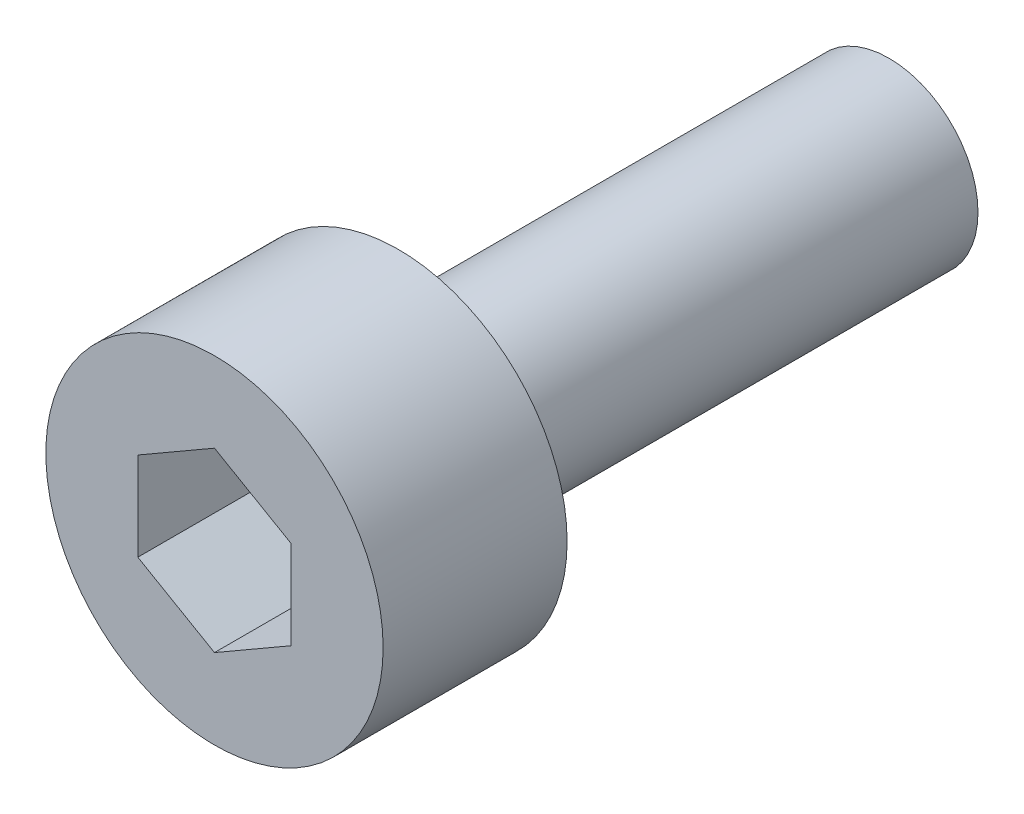
ISO-10303-21;
HEADER;
FILE_DESCRIPTION(('STEP AP214'),'2;1');
FILE_NAME('part.step','',(''),(''),'','','');
FILE_SCHEMA(('AUTOMOTIVE_DESIGN { 1 0 10303 214 1 1 1 1 }'));
ENDSEC;
DATA;
#1=APPLICATION_CONTEXT('core data for automotive mechanical design processes');
#2=APPLICATION_PROTOCOL_DEFINITION('international standard','automotive_design',2000,#1);
#3=PRODUCT_CONTEXT('',#1,'mechanical');
#4=PRODUCT('Part','Part','',(#3));
#5=PRODUCT_RELATED_PRODUCT_CATEGORY('part','',(#4));
#6=PRODUCT_DEFINITION_FORMATION('','',#4);
#7=PRODUCT_DEFINITION_CONTEXT('part definition',#1,'design');
#8=PRODUCT_DEFINITION('design','',#6,#7);
#9=PRODUCT_DEFINITION_SHAPE('','',#8);
#10=(LENGTH_UNIT() NAMED_UNIT(*) SI_UNIT(.MILLI.,.METRE.));
#11=(NAMED_UNIT(*) PLANE_ANGLE_UNIT() SI_UNIT($,.RADIAN.));
#12=(NAMED_UNIT(*) SI_UNIT($,.STERADIAN.) SOLID_ANGLE_UNIT());
#13=UNCERTAINTY_MEASURE_WITH_UNIT(LENGTH_MEASURE(1.E-05),#10,'distance_accuracy_value','');
#14=(GEOMETRIC_REPRESENTATION_CONTEXT(3) GLOBAL_UNCERTAINTY_ASSIGNED_CONTEXT((#13)) GLOBAL_UNIT_ASSIGNED_CONTEXT((#10,
#11,#12)) REPRESENTATION_CONTEXT('',''));
#15=CARTESIAN_POINT('',(0.,0.,0.));
#16=DIRECTION('',(0.,0.,1.));
#17=DIRECTION('',(1.,0.,0.));
#18=AXIS2_PLACEMENT_3D('',#15,#16,#17);
#19=CARTESIAN_POINT('',(0.,0.,-8.));
#20=DIRECTION('',(0.,0.,1.));
#21=DIRECTION('',(1.,0.,0.));
#22=AXIS2_PLACEMENT_3D('',#19,#20,#21);
#23=CYLINDRICAL_SURFACE('',#22,1.45);
#24=CARTESIAN_POINT('',(0.,0.,-8.));
#25=DIRECTION('',(0.,0.,1.));
#26=DIRECTION('',(1.,0.,0.));
#27=AXIS2_PLACEMENT_3D('',#24,#25,#26);
#28=CIRCLE('',#27,1.45);
#29=CARTESIAN_POINT('',(1.45,0.,-8.));
#30=VERTEX_POINT('',#29);
#31=EDGE_CURVE('E11',#30,#30,#28,.T.);
#32=ORIENTED_EDGE('',*,*,#31,.T.);
#33=EDGE_LOOP('',(#32));
#34=FACE_BOUND('',#33,.T.);
#35=CARTESIAN_POINT('',(0.,0.,0.));
#36=DIRECTION('',(0.,0.,1.));
#37=DIRECTION('',(1.,0.,0.));
#38=AXIS2_PLACEMENT_3D('',#35,#36,#37);
#39=CIRCLE('',#38,1.45);
#40=CARTESIAN_POINT('',(1.45,0.,0.));
#41=VERTEX_POINT('',#40);
#42=EDGE_CURVE('E44',#41,#41,#39,.T.);
#43=ORIENTED_EDGE('',*,*,#42,.F.);
#44=EDGE_LOOP('',(#43));
#45=FACE_BOUND('',#44,.T.);
#46=ADVANCED_FACE('F41',(#34,#45),#23,.T.);
#47=CARTESIAN_POINT('',(0.,0.,-8.));
#48=DIRECTION('',(0.,0.,1.));
#49=DIRECTION('',(1.,0.,0.));
#50=AXIS2_PLACEMENT_3D('',#47,#48,#49);
#51=PLANE('',#50);
#52=ORIENTED_EDGE('',*,*,#31,.F.);
#53=EDGE_LOOP('',(#52));
#54=FACE_BOUND('',#53,.T.);
#55=ADVANCED_FACE('F174',(#54),#51,.F.);
#56=CARTESIAN_POINT('',(0.,0.,3.));
#57=DIRECTION('',(0.,0.,-1.));
#58=DIRECTION('',(-1.,0.,0.));
#59=AXIS2_PLACEMENT_3D('',#56,#57,#58);
#60=CYLINDRICAL_SURFACE('',#59,2.75);
#61=CARTESIAN_POINT('',(0.,0.,3.));
#62=DIRECTION('',(0.,0.,1.));
#63=DIRECTION('',(1.,0.,0.));
#64=AXIS2_PLACEMENT_3D('',#61,#62,#63);
#65=CIRCLE('',#64,2.75);
#66=CARTESIAN_POINT('',(2.75,0.,3.));
#67=VERTEX_POINT('',#66);
#68=EDGE_CURVE('E148',#67,#67,#65,.T.);
#69=ORIENTED_EDGE('',*,*,#68,.F.);
#70=EDGE_LOOP('',(#69));
#71=FACE_BOUND('',#70,.T.);
#72=CARTESIAN_POINT('',(0.,0.,0.));
#73=DIRECTION('',(0.,0.,1.));
#74=DIRECTION('',(1.,0.,0.));
#75=AXIS2_PLACEMENT_3D('',#72,#73,#74);
#76=CIRCLE('',#75,2.75);
#77=CARTESIAN_POINT('',(2.75,0.,0.));
#78=VERTEX_POINT('',#77);
#79=EDGE_CURVE('E142',#78,#78,#76,.T.);
#80=ORIENTED_EDGE('',*,*,#79,.T.);
#81=EDGE_LOOP('',(#80));
#82=FACE_BOUND('',#81,.T.);
#83=ADVANCED_FACE('F154',(#71,#82),#60,.T.);
#84=CARTESIAN_POINT('',(0.,0.,3.));
#85=DIRECTION('',(0.,0.,1.));
#86=DIRECTION('',(1.,0.,0.));
#87=AXIS2_PLACEMENT_3D('',#84,#85,#86);
#88=PLANE('',#87);
#89=DIRECTION('',(0.,1.,0.));
#90=VECTOR('',#89,1.);
#91=CARTESIAN_POINT('',(1.25,-0.721687836487032,3.));
#92=LINE('',#91,#90);
#93=CARTESIAN_POINT('',(1.25,-0.721687836487032,3.));
#94=VERTEX_POINT('',#93);
#95=CARTESIAN_POINT('',(1.25,0.721687836487032,3.));
#96=VERTEX_POINT('',#95);
#97=EDGE_CURVE('E55',#94,#96,#92,.T.);
#98=ORIENTED_EDGE('',*,*,#97,.F.);
#99=DIRECTION('',(0.866025403784438,0.5,0.));
#100=VECTOR('',#99,1.);
#101=CARTESIAN_POINT('',(0.,-1.44337567297406,3.));
#102=LINE('',#101,#100);
#103=CARTESIAN_POINT('',(0.,-1.44337567297406,3.));
#104=VERTEX_POINT('',#103);
#105=EDGE_CURVE('E138',#104,#94,#102,.T.);
#106=ORIENTED_EDGE('',*,*,#105,.F.);
#107=DIRECTION('',(0.866025403784438,-0.5,0.));
#108=VECTOR('',#107,1.);
#109=CARTESIAN_POINT('',(-1.25,-0.721687836487032,3.));
#110=LINE('',#109,#108);
#111=CARTESIAN_POINT('',(-1.25,-0.721687836487032,3.));
#112=VERTEX_POINT('',#111);
#113=EDGE_CURVE('E136',#112,#104,#110,.T.);
#114=ORIENTED_EDGE('',*,*,#113,.F.);
#115=DIRECTION('',(0.,-1.,0.));
#116=VECTOR('',#115,1.);
#117=CARTESIAN_POINT('',(-1.25,0.721687836487033,3.));
#118=LINE('',#117,#116);
#119=CARTESIAN_POINT('',(-1.25,0.721687836487033,3.));
#120=VERTEX_POINT('',#119);
#121=EDGE_CURVE('E103',#120,#112,#118,.T.);
#122=ORIENTED_EDGE('',*,*,#121,.F.);
#123=DIRECTION('',(-0.866025403784439,-0.5,0.));
#124=VECTOR('',#123,1.);
#125=CARTESIAN_POINT('',(0.,1.44337567297406,3.));
#126=LINE('',#125,#124);
#127=CARTESIAN_POINT('',(0.,1.44337567297406,3.));
#128=VERTEX_POINT('',#127);
#129=EDGE_CURVE('E132',#128,#120,#126,.T.);
#130=ORIENTED_EDGE('',*,*,#129,.F.);
#131=DIRECTION('',(-0.866025403784439,0.5,0.));
#132=VECTOR('',#131,1.);
#133=CARTESIAN_POINT('',(1.25,0.721687836487032,3.));
#134=LINE('',#133,#132);
#135=EDGE_CURVE('E129',#96,#128,#134,.T.);
#136=ORIENTED_EDGE('',*,*,#135,.F.);
#137=EDGE_LOOP('',(#98,#106,#114,#122,#130,#136));
#138=FACE_BOUND('',#137,.T.);
#139=ORIENTED_EDGE('',*,*,#68,.T.);
#140=EDGE_LOOP('',(#139));
#141=FACE_BOUND('',#140,.T.);
#142=ADVANCED_FACE('F159',(#138,#141),#88,.T.);
#143=CARTESIAN_POINT('',(0.,0.,0.));
#144=DIRECTION('',(0.,0.,1.));
#145=DIRECTION('',(1.,0.,0.));
#146=AXIS2_PLACEMENT_3D('',#143,#144,#145);
#147=PLANE('',#146);
#148=ORIENTED_EDGE('',*,*,#42,.T.);
#149=EDGE_LOOP('',(#148));
#150=FACE_BOUND('',#149,.T.);
#151=ORIENTED_EDGE('',*,*,#79,.F.);
#152=EDGE_LOOP('',(#151));
#153=FACE_BOUND('',#152,.T.);
#154=ADVANCED_FACE('F156',(#150,#153),#147,.F.);
#155=CARTESIAN_POINT('',(1.25,-0.721687836487032,1.05));
#156=DIRECTION('',(1.,0.,0.));
#157=DIRECTION('',(0.,1.,0.));
#158=AXIS2_PLACEMENT_3D('',#155,#156,#157);
#159=PLANE('',#158);
#160=ORIENTED_EDGE('',*,*,#97,.T.);
#161=DIRECTION('',(0.,0.,1.));
#162=VECTOR('',#161,1.);
#163=CARTESIAN_POINT('',(1.25,0.721687836487032,1.05));
#164=LINE('',#163,#162);
#165=CARTESIAN_POINT('',(1.25,0.721687836487032,1.05));
#166=VERTEX_POINT('',#165);
#167=EDGE_CURVE('E85',#166,#96,#164,.T.);
#168=ORIENTED_EDGE('',*,*,#167,.F.);
#169=DIRECTION('',(0.,1.,0.));
#170=VECTOR('',#169,1.);
#171=CARTESIAN_POINT('',(1.25,-0.721687836487032,1.05));
#172=LINE('',#171,#170);
#173=CARTESIAN_POINT('',(1.25,-0.721687836487032,1.05));
#174=VERTEX_POINT('',#173);
#175=EDGE_CURVE('E140',#174,#166,#172,.T.);
#176=ORIENTED_EDGE('',*,*,#175,.F.);
#177=DIRECTION('',(0.,0.,1.));
#178=VECTOR('',#177,1.);
#179=CARTESIAN_POINT('',(1.25,-0.721687836487032,1.05));
#180=LINE('',#179,#178);
#181=EDGE_CURVE('E63',#174,#94,#180,.T.);
#182=ORIENTED_EDGE('',*,*,#181,.T.);
#183=EDGE_LOOP('',(#160,#168,#176,#182));
#184=FACE_BOUND('',#183,.T.);
#185=ADVANCED_FACE('F158',(#184),#159,.F.);
#186=CARTESIAN_POINT('',(0.,-1.44337567297406,1.05));
#187=DIRECTION('',(0.5,-0.866025403784438,0.));
#188=DIRECTION('',(0.866025403784439,0.5,0.));
#189=AXIS2_PLACEMENT_3D('',#186,#187,#188);
#190=PLANE('',#189);
#191=ORIENTED_EDGE('',*,*,#105,.T.);
#192=ORIENTED_EDGE('',*,*,#181,.F.);
#193=DIRECTION('',(0.866025403784438,0.5,0.));
#194=VECTOR('',#193,1.);
#195=CARTESIAN_POINT('',(0.,-1.44337567297406,1.05));
#196=LINE('',#195,#194);
#197=CARTESIAN_POINT('',(0.,-1.44337567297406,1.05));
#198=VERTEX_POINT('',#197);
#199=EDGE_CURVE('E115',#198,#174,#196,.T.);
#200=ORIENTED_EDGE('',*,*,#199,.F.);
#201=DIRECTION('',(0.,0.,1.));
#202=VECTOR('',#201,1.);
#203=CARTESIAN_POINT('',(0.,-1.44337567297406,1.05));
#204=LINE('',#203,#202);
#205=EDGE_CURVE('E107',#198,#104,#204,.T.);
#206=ORIENTED_EDGE('',*,*,#205,.T.);
#207=EDGE_LOOP('',(#191,#192,#200,#206));
#208=FACE_BOUND('',#207,.T.);
#209=ADVANCED_FACE('F167',(#208),#190,.F.);
#210=CARTESIAN_POINT('',(-1.25,-0.721687836487032,1.05));
#211=DIRECTION('',(-0.5,-0.866025403784438,0.));
#212=DIRECTION('',(0.866025403784439,-0.5,0.));
#213=AXIS2_PLACEMENT_3D('',#210,#211,#212);
#214=PLANE('',#213);
#215=ORIENTED_EDGE('',*,*,#113,.T.);
#216=ORIENTED_EDGE('',*,*,#205,.F.);
#217=DIRECTION('',(0.866025403784438,-0.5,0.));
#218=VECTOR('',#217,1.);
#219=CARTESIAN_POINT('',(-1.25,-0.721687836487032,1.05));
#220=LINE('',#219,#218);
#221=CARTESIAN_POINT('',(-1.25,-0.721687836487032,1.05));
#222=VERTEX_POINT('',#221);
#223=EDGE_CURVE('E111',#222,#198,#220,.T.);
#224=ORIENTED_EDGE('',*,*,#223,.F.);
#225=DIRECTION('',(0.,0.,1.));
#226=VECTOR('',#225,1.);
#227=CARTESIAN_POINT('',(-1.25,-0.721687836487032,1.05));
#228=LINE('',#227,#226);
#229=EDGE_CURVE('E96',#222,#112,#228,.T.);
#230=ORIENTED_EDGE('',*,*,#229,.T.);
#231=EDGE_LOOP('',(#215,#216,#224,#230));
#232=FACE_BOUND('',#231,.T.);
#233=ADVANCED_FACE('F112',(#232),#214,.F.);
#234=CARTESIAN_POINT('',(-1.25,0.721687836487033,1.05));
#235=DIRECTION('',(-1.,0.,0.));
#236=DIRECTION('',(0.,-1.,0.));
#237=AXIS2_PLACEMENT_3D('',#234,#235,#236);
#238=PLANE('',#237);
#239=ORIENTED_EDGE('',*,*,#121,.T.);
#240=ORIENTED_EDGE('',*,*,#229,.F.);
#241=DIRECTION('',(0.,-1.,0.));
#242=VECTOR('',#241,1.);
#243=CARTESIAN_POINT('',(-1.25,0.721687836487033,1.05));
#244=LINE('',#243,#242);
#245=CARTESIAN_POINT('',(-1.25,0.721687836487033,1.05));
#246=VERTEX_POINT('',#245);
#247=EDGE_CURVE('E100',#246,#222,#244,.T.);
#248=ORIENTED_EDGE('',*,*,#247,.F.);
#249=DIRECTION('',(0.,0.,1.));
#250=VECTOR('',#249,1.);
#251=CARTESIAN_POINT('',(-1.25,0.721687836487033,1.05));
#252=LINE('',#251,#250);
#253=EDGE_CURVE('E108',#246,#120,#252,.T.);
#254=ORIENTED_EDGE('',*,*,#253,.T.);
#255=EDGE_LOOP('',(#239,#240,#248,#254));
#256=FACE_BOUND('',#255,.T.);
#257=ADVANCED_FACE('F98',(#256),#238,.F.);
#258=CARTESIAN_POINT('',(0.,1.44337567297406,1.05));
#259=DIRECTION('',(-0.5,0.866025403784439,0.));
#260=DIRECTION('',(-0.866025403784439,-0.5,0.));
#261=AXIS2_PLACEMENT_3D('',#258,#259,#260);
#262=PLANE('',#261);
#263=ORIENTED_EDGE('',*,*,#129,.T.);
#264=ORIENTED_EDGE('',*,*,#253,.F.);
#265=DIRECTION('',(-0.866025403784439,-0.5,0.));
#266=VECTOR('',#265,1.);
#267=CARTESIAN_POINT('',(0.,1.44337567297406,1.05));
#268=LINE('',#267,#266);
#269=CARTESIAN_POINT('',(0.,1.44337567297406,1.05));
#270=VERTEX_POINT('',#269);
#271=EDGE_CURVE('E121',#270,#246,#268,.T.);
#272=ORIENTED_EDGE('',*,*,#271,.F.);
#273=DIRECTION('',(0.,0.,1.));
#274=VECTOR('',#273,1.);
#275=CARTESIAN_POINT('',(0.,1.44337567297406,1.05));
#276=LINE('',#275,#274);
#277=EDGE_CURVE('E145',#270,#128,#276,.T.);
#278=ORIENTED_EDGE('',*,*,#277,.T.);
#279=EDGE_LOOP('',(#263,#264,#272,#278));
#280=FACE_BOUND('',#279,.T.);
#281=ADVANCED_FACE('F235',(#280),#262,.F.);
#282=CARTESIAN_POINT('',(1.25,0.721687836487032,1.05));
#283=DIRECTION('',(0.5,0.866025403784439,0.));
#284=DIRECTION('',(-0.866025403784439,0.5,0.));
#285=AXIS2_PLACEMENT_3D('',#282,#283,#284);
#286=PLANE('',#285);
#287=ORIENTED_EDGE('',*,*,#135,.T.);
#288=ORIENTED_EDGE('',*,*,#277,.F.);
#289=DIRECTION('',(-0.866025403784439,0.5,0.));
#290=VECTOR('',#289,1.);
#291=CARTESIAN_POINT('',(1.25,0.721687836487032,1.05));
#292=LINE('',#291,#290);
#293=EDGE_CURVE('E123',#166,#270,#292,.T.);
#294=ORIENTED_EDGE('',*,*,#293,.F.);
#295=ORIENTED_EDGE('',*,*,#167,.T.);
#296=EDGE_LOOP('',(#287,#288,#294,#295));
#297=FACE_BOUND('',#296,.T.);
#298=ADVANCED_FACE('F244',(#297),#286,.F.);
#299=CARTESIAN_POINT('',(0.,0.,1.05));
#300=DIRECTION('',(0.,0.,1.));
#301=DIRECTION('',(1.,0.,0.));
#302=AXIS2_PLACEMENT_3D('',#299,#300,#301);
#303=PLANE('',#302);
#304=ORIENTED_EDGE('',*,*,#175,.T.);
#305=ORIENTED_EDGE('',*,*,#293,.T.);
#306=ORIENTED_EDGE('',*,*,#271,.T.);
#307=ORIENTED_EDGE('',*,*,#247,.T.);
#308=ORIENTED_EDGE('',*,*,#223,.T.);
#309=ORIENTED_EDGE('',*,*,#199,.T.);
#310=EDGE_LOOP('',(#304,#305,#306,#307,#308,#309));
#311=FACE_BOUND('',#310,.T.);
#312=ADVANCED_FACE('F118',(#311),#303,.T.);
#313=CLOSED_SHELL('',(#46,#55,#83,#142,#154,#185,#209,#233,#257,#281,#298,#312));
#314=MANIFOLD_SOLID_BREP('B2',#313);
#315=ADVANCED_BREP_SHAPE_REPRESENTATION('',(#18,#314),#14);
#316=SHAPE_DEFINITION_REPRESENTATION(#9,#315);
ENDSEC;
END-ISO-10303-21;
